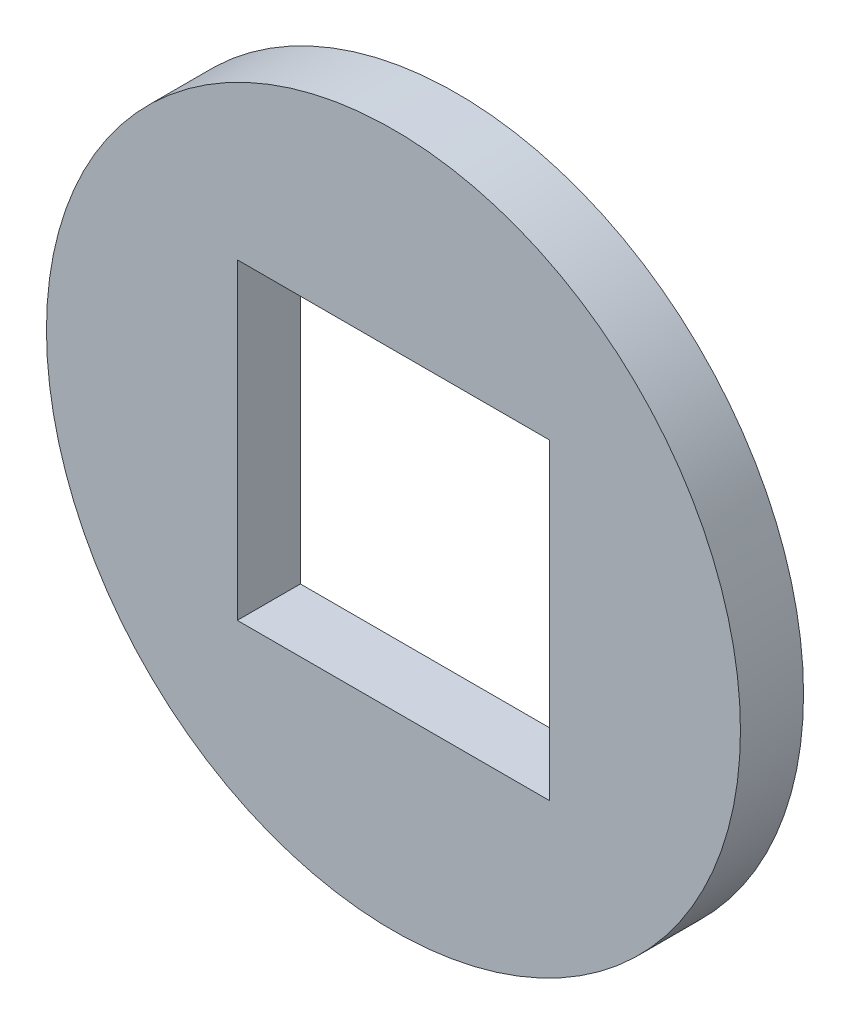
ISO-10303-21;
HEADER;
FILE_DESCRIPTION(('STEP AP214'),'2;1');
FILE_NAME('part.step','',(''),(''),'','','');
FILE_SCHEMA(('AUTOMOTIVE_DESIGN { 1 0 10303 214 1 1 1 1 }'));
ENDSEC;
DATA;
#1=APPLICATION_CONTEXT('core data for automotive mechanical design processes');
#2=APPLICATION_PROTOCOL_DEFINITION('international standard','automotive_design',2000,#1);
#3=PRODUCT_CONTEXT('',#1,'mechanical');
#4=PRODUCT('Part','Part','',(#3));
#5=PRODUCT_RELATED_PRODUCT_CATEGORY('part','',(#4));
#6=PRODUCT_DEFINITION_FORMATION('','',#4);
#7=PRODUCT_DEFINITION_CONTEXT('part definition',#1,'design');
#8=PRODUCT_DEFINITION('design','',#6,#7);
#9=PRODUCT_DEFINITION_SHAPE('','',#8);
#10=(LENGTH_UNIT() NAMED_UNIT(*) SI_UNIT(.MILLI.,.METRE.));
#11=(NAMED_UNIT(*) PLANE_ANGLE_UNIT() SI_UNIT($,.RADIAN.));
#12=(NAMED_UNIT(*) SI_UNIT($,.STERADIAN.) SOLID_ANGLE_UNIT());
#13=UNCERTAINTY_MEASURE_WITH_UNIT(LENGTH_MEASURE(1.E-05),#10,'distance_accuracy_value','');
#14=(GEOMETRIC_REPRESENTATION_CONTEXT(3) GLOBAL_UNCERTAINTY_ASSIGNED_CONTEXT((#13)) GLOBAL_UNIT_ASSIGNED_CONTEXT((#10,
#11,#12)) REPRESENTATION_CONTEXT('',''));
#15=CARTESIAN_POINT('',(0.,0.,0.));
#16=DIRECTION('',(0.,0.,1.));
#17=DIRECTION('',(1.,0.,0.));
#18=AXIS2_PLACEMENT_3D('',#15,#16,#17);
#19=CARTESIAN_POINT('',(0.,0.,1.));
#20=DIRECTION('',(0.,0.,1.));
#21=DIRECTION('',(1.,0.,0.));
#22=AXIS2_PLACEMENT_3D('',#19,#20,#21);
#23=PLANE('',#22);
#24=CARTESIAN_POINT('',(0.,0.,1.));
#25=DIRECTION('',(0.,0.,1.));
#26=DIRECTION('',(1.,0.,0.));
#27=AXIS2_PLACEMENT_3D('',#24,#25,#26);
#28=CIRCLE('',#27,5.5);
#29=CARTESIAN_POINT('',(5.5,0.,1.));
#30=VERTEX_POINT('',#29);
#31=EDGE_CURVE('E11',#30,#30,#28,.T.);
#32=ORIENTED_EDGE('',*,*,#31,.T.);
#33=EDGE_LOOP('',(#32));
#34=FACE_BOUND('',#33,.T.);
#35=DIRECTION('',(1.,0.,0.));
#36=VECTOR('',#35,1.);
#37=CARTESIAN_POINT('',(-2.47487373415292,-2.47487373415292,1.));
#38=LINE('',#37,#36);
#39=CARTESIAN_POINT('',(-2.47487373415292,-2.47487373415292,1.));
#40=VERTEX_POINT('',#39);
#41=CARTESIAN_POINT('',(2.47487373415292,-2.47487373415292,1.));
#42=VERTEX_POINT('',#41);
#43=EDGE_CURVE('E79',#40,#42,#38,.T.);
#44=ORIENTED_EDGE('',*,*,#43,.F.);
#45=DIRECTION('',(0.,-1.,0.));
#46=VECTOR('',#45,1.);
#47=CARTESIAN_POINT('',(-2.47487373415292,2.47487373415292,1.));
#48=LINE('',#47,#46);
#49=CARTESIAN_POINT('',(-2.47487373415292,2.47487373415292,1.));
#50=VERTEX_POINT('',#49);
#51=EDGE_CURVE('E71',#50,#40,#48,.T.);
#52=ORIENTED_EDGE('',*,*,#51,.F.);
#53=DIRECTION('',(-1.,0.,0.));
#54=VECTOR('',#53,1.);
#55=CARTESIAN_POINT('',(-2.47487373415292,2.47487373415292,1.));
#56=LINE('',#55,#54);
#57=CARTESIAN_POINT('',(2.47487373415292,2.47487373415292,1.));
#58=VERTEX_POINT('',#57);
#59=EDGE_CURVE('E92',#58,#50,#56,.T.);
#60=ORIENTED_EDGE('',*,*,#59,.F.);
#61=DIRECTION('',(0.,1.,0.));
#62=VECTOR('',#61,1.);
#63=CARTESIAN_POINT('',(2.47487373415292,2.47487373415292,1.));
#64=LINE('',#63,#62);
#65=EDGE_CURVE('E90',#42,#58,#64,.T.);
#66=ORIENTED_EDGE('',*,*,#65,.F.);
#67=EDGE_LOOP('',(#44,#52,#60,#66));
#68=FACE_BOUND('',#67,.T.);
#69=ADVANCED_FACE('F30',(#34,#68),#23,.T.);
#70=CARTESIAN_POINT('',(0.,0.,0.));
#71=DIRECTION('',(0.,0.,1.));
#72=DIRECTION('',(1.,0.,0.));
#73=AXIS2_PLACEMENT_3D('',#70,#71,#72);
#74=PLANE('',#73);
#75=CARTESIAN_POINT('',(0.,0.,0.));
#76=DIRECTION('',(0.,0.,1.));
#77=DIRECTION('',(1.,0.,0.));
#78=AXIS2_PLACEMENT_3D('',#75,#76,#77);
#79=CIRCLE('',#78,5.5);
#80=CARTESIAN_POINT('',(5.5,0.,0.));
#81=VERTEX_POINT('',#80);
#82=EDGE_CURVE('E34',#81,#81,#79,.T.);
#83=ORIENTED_EDGE('',*,*,#82,.F.);
#84=EDGE_LOOP('',(#83));
#85=FACE_BOUND('',#84,.T.);
#86=DIRECTION('',(0.,-1.,0.));
#87=VECTOR('',#86,1.);
#88=CARTESIAN_POINT('',(-2.47487373415292,2.47487373415292,0.));
#89=LINE('',#88,#87);
#90=CARTESIAN_POINT('',(-2.47487373415292,2.47487373415292,0.));
#91=VERTEX_POINT('',#90);
#92=CARTESIAN_POINT('',(-2.47487373415292,-2.47487373415292,0.));
#93=VERTEX_POINT('',#92);
#94=EDGE_CURVE('E53',#91,#93,#89,.T.);
#95=ORIENTED_EDGE('',*,*,#94,.T.);
#96=DIRECTION('',(1.,0.,0.));
#97=VECTOR('',#96,1.);
#98=CARTESIAN_POINT('',(-2.47487373415292,-2.47487373415292,0.));
#99=LINE('',#98,#97);
#100=CARTESIAN_POINT('',(2.47487373415292,-2.47487373415292,0.));
#101=VERTEX_POINT('',#100);
#102=EDGE_CURVE('E86',#93,#101,#99,.T.);
#103=ORIENTED_EDGE('',*,*,#102,.T.);
#104=DIRECTION('',(0.,1.,0.));
#105=VECTOR('',#104,1.);
#106=CARTESIAN_POINT('',(2.47487373415292,2.47487373415292,0.));
#107=LINE('',#106,#105);
#108=CARTESIAN_POINT('',(2.47487373415292,2.47487373415292,0.));
#109=VERTEX_POINT('',#108);
#110=EDGE_CURVE('E98',#101,#109,#107,.T.);
#111=ORIENTED_EDGE('',*,*,#110,.T.);
#112=DIRECTION('',(-1.,0.,0.));
#113=VECTOR('',#112,1.);
#114=CARTESIAN_POINT('',(-2.47487373415292,2.47487373415292,0.));
#115=LINE('',#114,#113);
#116=EDGE_CURVE('E80',#109,#91,#115,.T.);
#117=ORIENTED_EDGE('',*,*,#116,.T.);
#118=EDGE_LOOP('',(#95,#103,#111,#117));
#119=FACE_BOUND('',#118,.T.);
#120=ADVANCED_FACE('F109',(#85,#119),#74,.F.);
#121=CARTESIAN_POINT('',(0.,0.,1.));
#122=DIRECTION('',(0.,0.,-1.));
#123=DIRECTION('',(-1.,0.,0.));
#124=AXIS2_PLACEMENT_3D('',#121,#122,#123);
#125=CYLINDRICAL_SURFACE('',#124,5.5);
#126=ORIENTED_EDGE('',*,*,#31,.F.);
#127=EDGE_LOOP('',(#126));
#128=FACE_BOUND('',#127,.T.);
#129=ORIENTED_EDGE('',*,*,#82,.T.);
#130=EDGE_LOOP('',(#129));
#131=FACE_BOUND('',#130,.T.);
#132=ADVANCED_FACE('F32',(#128,#131),#125,.T.);
#133=CARTESIAN_POINT('',(-2.47487373415292,2.47487373415292,1.));
#134=DIRECTION('',(1.,0.,0.));
#135=DIRECTION('',(0.,0.,-1.));
#136=AXIS2_PLACEMENT_3D('',#133,#134,#135);
#137=PLANE('',#136);
#138=ORIENTED_EDGE('',*,*,#94,.F.);
#139=DIRECTION('',(0.,0.,-1.));
#140=VECTOR('',#139,1.);
#141=CARTESIAN_POINT('',(-2.47487373415292,2.47487373415292,1.));
#142=LINE('',#141,#140);
#143=EDGE_CURVE('E75',#50,#91,#142,.T.);
#144=ORIENTED_EDGE('',*,*,#143,.F.);
#145=ORIENTED_EDGE('',*,*,#51,.T.);
#146=DIRECTION('',(0.,0.,-1.));
#147=VECTOR('',#146,1.);
#148=CARTESIAN_POINT('',(-2.47487373415292,-2.47487373415292,1.));
#149=LINE('',#148,#147);
#150=EDGE_CURVE('E74',#40,#93,#149,.T.);
#151=ORIENTED_EDGE('',*,*,#150,.T.);
#152=EDGE_LOOP('',(#138,#144,#145,#151));
#153=FACE_BOUND('',#152,.T.);
#154=ADVANCED_FACE('F73',(#153),#137,.T.);
#155=CARTESIAN_POINT('',(-2.47487373415292,-2.47487373415292,1.));
#156=DIRECTION('',(0.,1.,0.));
#157=DIRECTION('',(0.,0.,1.));
#158=AXIS2_PLACEMENT_3D('',#155,#156,#157);
#159=PLANE('',#158);
#160=ORIENTED_EDGE('',*,*,#102,.F.);
#161=ORIENTED_EDGE('',*,*,#150,.F.);
#162=ORIENTED_EDGE('',*,*,#43,.T.);
#163=DIRECTION('',(0.,0.,-1.));
#164=VECTOR('',#163,1.);
#165=CARTESIAN_POINT('',(2.47487373415292,-2.47487373415292,1.));
#166=LINE('',#165,#164);
#167=EDGE_CURVE('E87',#42,#101,#166,.T.);
#168=ORIENTED_EDGE('',*,*,#167,.T.);
#169=EDGE_LOOP('',(#160,#161,#162,#168));
#170=FACE_BOUND('',#169,.T.);
#171=ADVANCED_FACE('F83',(#170),#159,.T.);
#172=CARTESIAN_POINT('',(2.47487373415292,2.47487373415292,1.));
#173=DIRECTION('',(-1.,0.,0.));
#174=DIRECTION('',(0.,0.,1.));
#175=AXIS2_PLACEMENT_3D('',#172,#173,#174);
#176=PLANE('',#175);
#177=ORIENTED_EDGE('',*,*,#110,.F.);
#178=ORIENTED_EDGE('',*,*,#167,.F.);
#179=ORIENTED_EDGE('',*,*,#65,.T.);
#180=DIRECTION('',(0.,0.,-1.));
#181=VECTOR('',#180,1.);
#182=CARTESIAN_POINT('',(2.47487373415292,2.47487373415292,1.));
#183=LINE('',#182,#181);
#184=EDGE_CURVE('E45',#58,#109,#183,.T.);
#185=ORIENTED_EDGE('',*,*,#184,.T.);
#186=EDGE_LOOP('',(#177,#178,#179,#185));
#187=FACE_BOUND('',#186,.T.);
#188=ADVANCED_FACE('F107',(#187),#176,.T.);
#189=CARTESIAN_POINT('',(-2.47487373415292,2.47487373415292,1.));
#190=DIRECTION('',(0.,-1.,0.));
#191=DIRECTION('',(0.,0.,-1.));
#192=AXIS2_PLACEMENT_3D('',#189,#190,#191);
#193=PLANE('',#192);
#194=ORIENTED_EDGE('',*,*,#116,.F.);
#195=ORIENTED_EDGE('',*,*,#184,.F.);
#196=ORIENTED_EDGE('',*,*,#59,.T.);
#197=ORIENTED_EDGE('',*,*,#143,.T.);
#198=EDGE_LOOP('',(#194,#195,#196,#197));
#199=FACE_BOUND('',#198,.T.);
#200=ADVANCED_FACE('F110',(#199),#193,.T.);
#201=CLOSED_SHELL('',(#69,#120,#132,#154,#171,#188,#200));
#202=MANIFOLD_SOLID_BREP('B2',#201);
#203=ADVANCED_BREP_SHAPE_REPRESENTATION('',(#18,#202),#14);
#204=SHAPE_DEFINITION_REPRESENTATION(#9,#203);
ENDSEC;
END-ISO-10303-21;
